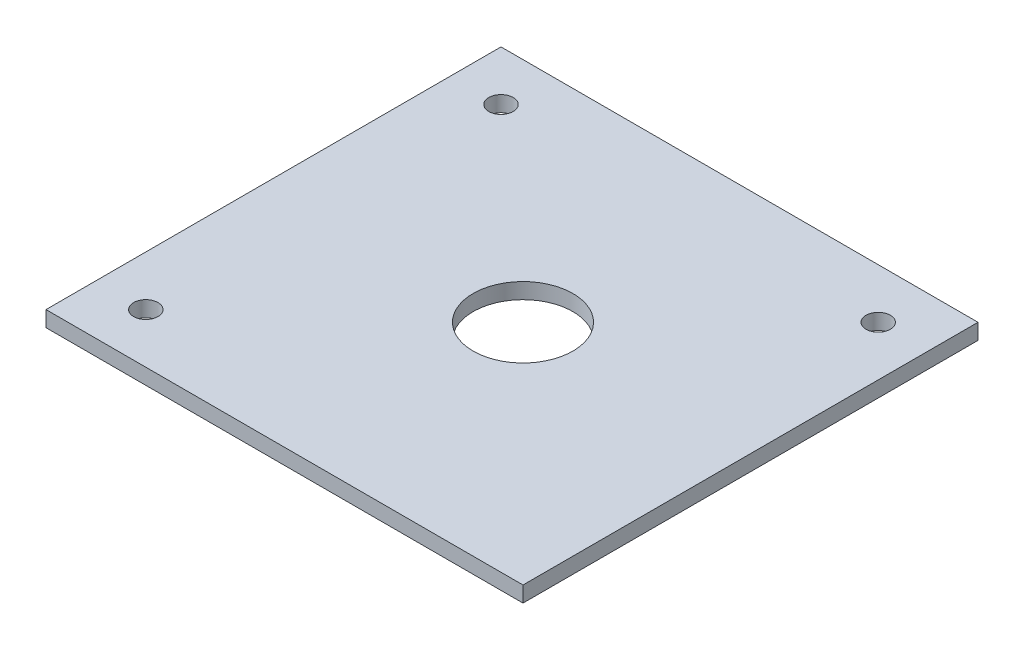
ISO-10303-21;
HEADER;
FILE_DESCRIPTION(('STEP AP214'),'2;1');
FILE_NAME('part.step','',(''),(''),'','','');
FILE_SCHEMA(('AUTOMOTIVE_DESIGN { 1 0 10303 214 1 1 1 1 }'));
ENDSEC;
DATA;
#1=APPLICATION_CONTEXT('core data for automotive mechanical design processes');
#2=APPLICATION_PROTOCOL_DEFINITION('international standard','automotive_design',2000,#1);
#3=PRODUCT_CONTEXT('',#1,'mechanical');
#4=PRODUCT('Part','Part','',(#3));
#5=PRODUCT_RELATED_PRODUCT_CATEGORY('part','',(#4));
#6=PRODUCT_DEFINITION_FORMATION('','',#4);
#7=PRODUCT_DEFINITION_CONTEXT('part definition',#1,'design');
#8=PRODUCT_DEFINITION('design','',#6,#7);
#9=PRODUCT_DEFINITION_SHAPE('','',#8);
#10=(LENGTH_UNIT() NAMED_UNIT(*) SI_UNIT(.MILLI.,.METRE.));
#11=(NAMED_UNIT(*) PLANE_ANGLE_UNIT() SI_UNIT($,.RADIAN.));
#12=(NAMED_UNIT(*) SI_UNIT($,.STERADIAN.) SOLID_ANGLE_UNIT());
#13=UNCERTAINTY_MEASURE_WITH_UNIT(LENGTH_MEASURE(1.E-05),#10,'distance_accuracy_value','');
#14=(GEOMETRIC_REPRESENTATION_CONTEXT(3) GLOBAL_UNCERTAINTY_ASSIGNED_CONTEXT((#13)) GLOBAL_UNIT_ASSIGNED_CONTEXT((#10,
#11,#12)) REPRESENTATION_CONTEXT('',''));
#15=CARTESIAN_POINT('',(0.,0.,0.));
#16=DIRECTION('',(0.,0.,1.));
#17=DIRECTION('',(1.,0.,0.));
#18=AXIS2_PLACEMENT_3D('',#15,#16,#17);
#19=CARTESIAN_POINT('',(0.,4.,0.));
#20=DIRECTION('',(0.,1.,0.));
#21=DIRECTION('',(0.,0.,1.));
#22=AXIS2_PLACEMENT_3D('',#19,#20,#21);
#23=PLANE('',#22);
#24=CARTESIAN_POINT('',(109.417527054984,4.,12.7));
#25=DIRECTION('',(0.,1.,0.));
#26=DIRECTION('',(0.,0.,1.));
#27=AXIS2_PLACEMENT_3D('',#24,#25,#26);
#28=CIRCLE('',#27,3.1);
#29=CARTESIAN_POINT('',(109.417527054984,4.,15.8));
#30=VERTEX_POINT('',#29);
#31=EDGE_CURVE('E131',#30,#30,#28,.T.);
#32=ORIENTED_EDGE('',*,*,#31,.F.);
#33=EDGE_LOOP('',(#32));
#34=FACE_BOUND('',#33,.T.);
#35=CARTESIAN_POINT('',(64.2175270549846,4.,57.9));
#36=DIRECTION('',(0.,1.,0.));
#37=DIRECTION('',(0.,0.,1.));
#38=AXIS2_PLACEMENT_3D('',#35,#36,#37);
#39=CIRCLE('',#38,12.7);
#40=CARTESIAN_POINT('',(64.2175270549846,4.,70.6));
#41=VERTEX_POINT('',#40);
#42=EDGE_CURVE('E110',#41,#41,#39,.T.);
#43=ORIENTED_EDGE('',*,*,#42,.F.);
#44=EDGE_LOOP('',(#43));
#45=FACE_BOUND('',#44,.T.);
#46=DIRECTION('',(0.,0.,-1.));
#47=VECTOR('',#46,1.);
#48=CARTESIAN_POINT('',(122.117527054984,4.,0.));
#49=LINE('',#48,#47);
#50=CARTESIAN_POINT('',(122.117527054984,4.,115.8));
#51=VERTEX_POINT('',#50);
#52=CARTESIAN_POINT('',(122.117527054984,4.,0.));
#53=VERTEX_POINT('',#52);
#54=EDGE_CURVE('E95',#51,#53,#49,.T.);
#55=ORIENTED_EDGE('',*,*,#54,.T.);
#56=DIRECTION('',(-1.,0.,0.));
#57=VECTOR('',#56,1.);
#58=CARTESIAN_POINT('',(0.717527054983736,4.,0.));
#59=LINE('',#58,#57);
#60=CARTESIAN_POINT('',(0.717527054983736,4.,0.));
#61=VERTEX_POINT('',#60);
#62=EDGE_CURVE('E90',#53,#61,#59,.T.);
#63=ORIENTED_EDGE('',*,*,#62,.T.);
#64=DIRECTION('',(0.,0.,1.));
#65=VECTOR('',#64,1.);
#66=CARTESIAN_POINT('',(0.717527054983736,4.,0.));
#67=LINE('',#66,#65);
#68=CARTESIAN_POINT('',(0.717527054983764,4.,115.8));
#69=VERTEX_POINT('',#68);
#70=EDGE_CURVE('E93',#61,#69,#67,.T.);
#71=ORIENTED_EDGE('',*,*,#70,.T.);
#72=DIRECTION('',(1.,0.,0.));
#73=VECTOR('',#72,1.);
#74=CARTESIAN_POINT('',(0.717527054983764,4.,115.8));
#75=LINE('',#74,#73);
#76=EDGE_CURVE('E60',#69,#51,#75,.T.);
#77=ORIENTED_EDGE('',*,*,#76,.T.);
#78=EDGE_LOOP('',(#55,#63,#71,#77));
#79=FACE_BOUND('',#78,.T.);
#80=CARTESIAN_POINT('',(13.4175270549837,4.,12.7));
#81=DIRECTION('',(0.,1.,0.));
#82=DIRECTION('',(0.,0.,1.));
#83=AXIS2_PLACEMENT_3D('',#80,#81,#82);
#84=CIRCLE('',#83,3.1);
#85=CARTESIAN_POINT('',(13.4175270549837,4.,15.8));
#86=VERTEX_POINT('',#85);
#87=EDGE_CURVE('E125',#86,#86,#84,.T.);
#88=ORIENTED_EDGE('',*,*,#87,.F.);
#89=EDGE_LOOP('',(#88));
#90=FACE_BOUND('',#89,.T.);
#91=CARTESIAN_POINT('',(13.4175270549838,4.,103.1));
#92=DIRECTION('',(0.,1.,0.));
#93=DIRECTION('',(0.,0.,1.));
#94=AXIS2_PLACEMENT_3D('',#91,#92,#93);
#95=CIRCLE('',#94,3.10000000000001);
#96=CARTESIAN_POINT('',(13.4175270549838,4.,106.2));
#97=VERTEX_POINT('',#96);
#98=EDGE_CURVE('E137',#97,#97,#95,.T.);
#99=ORIENTED_EDGE('',*,*,#98,.F.);
#100=EDGE_LOOP('',(#99));
#101=FACE_BOUND('',#100,.T.);
#102=ADVANCED_FACE('F43',(#34,#45,#79,#90,#101),#23,.T.);
#103=CARTESIAN_POINT('',(0.,0.,0.));
#104=DIRECTION('',(0.,1.,0.));
#105=DIRECTION('',(0.,0.,1.));
#106=AXIS2_PLACEMENT_3D('',#103,#104,#105);
#107=PLANE('',#106);
#108=DIRECTION('',(0.,0.,-1.));
#109=VECTOR('',#108,1.);
#110=CARTESIAN_POINT('',(122.117527054984,0.,0.));
#111=LINE('',#110,#109);
#112=CARTESIAN_POINT('',(122.117527054984,0.,115.8));
#113=VERTEX_POINT('',#112);
#114=CARTESIAN_POINT('',(122.117527054984,0.,0.));
#115=VERTEX_POINT('',#114);
#116=EDGE_CURVE('E107',#113,#115,#111,.T.);
#117=ORIENTED_EDGE('',*,*,#116,.F.);
#118=DIRECTION('',(1.,0.,0.));
#119=VECTOR('',#118,1.);
#120=CARTESIAN_POINT('',(0.717527054983764,0.,115.8));
#121=LINE('',#120,#119);
#122=CARTESIAN_POINT('',(0.717527054983764,0.,115.8));
#123=VERTEX_POINT('',#122);
#124=EDGE_CURVE('E83',#123,#113,#121,.T.);
#125=ORIENTED_EDGE('',*,*,#124,.F.);
#126=DIRECTION('',(0.,0.,1.));
#127=VECTOR('',#126,1.);
#128=CARTESIAN_POINT('',(0.717527054983736,0.,0.));
#129=LINE('',#128,#127);
#130=CARTESIAN_POINT('',(0.717527054983736,0.,0.));
#131=VERTEX_POINT('',#130);
#132=EDGE_CURVE('E77',#131,#123,#129,.T.);
#133=ORIENTED_EDGE('',*,*,#132,.F.);
#134=DIRECTION('',(-1.,0.,0.));
#135=VECTOR('',#134,1.);
#136=CARTESIAN_POINT('',(0.717527054983736,0.,0.));
#137=LINE('',#136,#135);
#138=EDGE_CURVE('E99',#115,#131,#137,.T.);
#139=ORIENTED_EDGE('',*,*,#138,.F.);
#140=EDGE_LOOP('',(#117,#125,#133,#139));
#141=FACE_BOUND('',#140,.T.);
#142=CARTESIAN_POINT('',(64.2175270549846,0.,57.9));
#143=DIRECTION('',(0.,1.,0.));
#144=DIRECTION('',(0.,0.,1.));
#145=AXIS2_PLACEMENT_3D('',#142,#143,#144);
#146=CIRCLE('',#145,12.7);
#147=CARTESIAN_POINT('',(64.2175270549846,0.,70.6));
#148=VERTEX_POINT('',#147);
#149=EDGE_CURVE('E122',#148,#148,#146,.T.);
#150=ORIENTED_EDGE('',*,*,#149,.T.);
#151=EDGE_LOOP('',(#150));
#152=FACE_BOUND('',#151,.T.);
#153=CARTESIAN_POINT('',(13.4175270549837,0.,12.7));
#154=DIRECTION('',(0.,1.,0.));
#155=DIRECTION('',(0.,0.,1.));
#156=AXIS2_PLACEMENT_3D('',#153,#154,#155);
#157=CIRCLE('',#156,3.1);
#158=CARTESIAN_POINT('',(13.4175270549837,0.,15.8));
#159=VERTEX_POINT('',#158);
#160=EDGE_CURVE('E128',#159,#159,#157,.T.);
#161=ORIENTED_EDGE('',*,*,#160,.T.);
#162=EDGE_LOOP('',(#161));
#163=FACE_BOUND('',#162,.T.);
#164=CARTESIAN_POINT('',(109.417527054984,0.,12.7));
#165=DIRECTION('',(0.,1.,0.));
#166=DIRECTION('',(0.,0.,1.));
#167=AXIS2_PLACEMENT_3D('',#164,#165,#166);
#168=CIRCLE('',#167,3.1);
#169=CARTESIAN_POINT('',(109.417527054984,0.,15.8));
#170=VERTEX_POINT('',#169);
#171=EDGE_CURVE('E134',#170,#170,#168,.T.);
#172=ORIENTED_EDGE('',*,*,#171,.T.);
#173=EDGE_LOOP('',(#172));
#174=FACE_BOUND('',#173,.T.);
#175=CARTESIAN_POINT('',(13.4175270549838,0.,103.1));
#176=DIRECTION('',(0.,1.,0.));
#177=DIRECTION('',(0.,0.,1.));
#178=AXIS2_PLACEMENT_3D('',#175,#176,#177);
#179=CIRCLE('',#178,3.10000000000001);
#180=CARTESIAN_POINT('',(13.4175270549838,0.,106.2));
#181=VERTEX_POINT('',#180);
#182=EDGE_CURVE('E140',#181,#181,#179,.T.);
#183=ORIENTED_EDGE('',*,*,#182,.T.);
#184=EDGE_LOOP('',(#183));
#185=FACE_BOUND('',#184,.T.);
#186=ADVANCED_FACE('F118',(#141,#152,#163,#174,#185),#107,.F.);
#187=CARTESIAN_POINT('',(122.117527054984,4.,0.));
#188=DIRECTION('',(-1.,0.,0.));
#189=DIRECTION('',(0.,0.,1.));
#190=AXIS2_PLACEMENT_3D('',#187,#188,#189);
#191=PLANE('',#190);
#192=ORIENTED_EDGE('',*,*,#116,.T.);
#193=DIRECTION('',(0.,-1.,0.));
#194=VECTOR('',#193,1.);
#195=CARTESIAN_POINT('',(122.117527054984,4.,0.));
#196=LINE('',#195,#194);
#197=EDGE_CURVE('E11',#53,#115,#196,.T.);
#198=ORIENTED_EDGE('',*,*,#197,.F.);
#199=ORIENTED_EDGE('',*,*,#54,.F.);
#200=DIRECTION('',(0.,-1.,0.));
#201=VECTOR('',#200,1.);
#202=CARTESIAN_POINT('',(122.117527054984,4.,115.8));
#203=LINE('',#202,#201);
#204=EDGE_CURVE('E103',#51,#113,#203,.T.);
#205=ORIENTED_EDGE('',*,*,#204,.T.);
#206=EDGE_LOOP('',(#192,#198,#199,#205));
#207=FACE_BOUND('',#206,.T.);
#208=ADVANCED_FACE('F45',(#207),#191,.F.);
#209=CARTESIAN_POINT('',(0.717527054983736,4.,0.));
#210=DIRECTION('',(0.,0.,1.));
#211=DIRECTION('',(1.,0.,0.));
#212=AXIS2_PLACEMENT_3D('',#209,#210,#211);
#213=PLANE('',#212);
#214=ORIENTED_EDGE('',*,*,#138,.T.);
#215=DIRECTION('',(0.,-1.,0.));
#216=VECTOR('',#215,1.);
#217=CARTESIAN_POINT('',(0.717527054983736,4.,0.));
#218=LINE('',#217,#216);
#219=EDGE_CURVE('E52',#61,#131,#218,.T.);
#220=ORIENTED_EDGE('',*,*,#219,.F.);
#221=ORIENTED_EDGE('',*,*,#62,.F.);
#222=ORIENTED_EDGE('',*,*,#197,.T.);
#223=EDGE_LOOP('',(#214,#220,#221,#222));
#224=FACE_BOUND('',#223,.T.);
#225=ADVANCED_FACE('F98',(#224),#213,.F.);
#226=CARTESIAN_POINT('',(0.717527054983736,4.,0.));
#227=DIRECTION('',(1.,0.,0.));
#228=DIRECTION('',(0.,0.,-1.));
#229=AXIS2_PLACEMENT_3D('',#226,#227,#228);
#230=PLANE('',#229);
#231=ORIENTED_EDGE('',*,*,#132,.T.);
#232=DIRECTION('',(0.,-1.,0.));
#233=VECTOR('',#232,1.);
#234=CARTESIAN_POINT('',(0.717527054983764,4.,115.8));
#235=LINE('',#234,#233);
#236=EDGE_CURVE('E100',#69,#123,#235,.T.);
#237=ORIENTED_EDGE('',*,*,#236,.F.);
#238=ORIENTED_EDGE('',*,*,#70,.F.);
#239=ORIENTED_EDGE('',*,*,#219,.T.);
#240=EDGE_LOOP('',(#231,#237,#238,#239));
#241=FACE_BOUND('',#240,.T.);
#242=ADVANCED_FACE('F101',(#241),#230,.F.);
#243=CARTESIAN_POINT('',(0.717527054983764,4.,115.8));
#244=DIRECTION('',(0.,0.,-1.));
#245=DIRECTION('',(-1.,0.,0.));
#246=AXIS2_PLACEMENT_3D('',#243,#244,#245);
#247=PLANE('',#246);
#248=ORIENTED_EDGE('',*,*,#124,.T.);
#249=ORIENTED_EDGE('',*,*,#204,.F.);
#250=ORIENTED_EDGE('',*,*,#76,.F.);
#251=ORIENTED_EDGE('',*,*,#236,.T.);
#252=EDGE_LOOP('',(#248,#249,#250,#251));
#253=FACE_BOUND('',#252,.T.);
#254=ADVANCED_FACE('F115',(#253),#247,.F.);
#255=CARTESIAN_POINT('',(64.2175270549846,4.,57.9));
#256=DIRECTION('',(0.,-1.,0.));
#257=DIRECTION('',(0.,0.,-1.));
#258=AXIS2_PLACEMENT_3D('',#255,#256,#257);
#259=CYLINDRICAL_SURFACE('',#258,12.7);
#260=ORIENTED_EDGE('',*,*,#42,.T.);
#261=EDGE_LOOP('',(#260));
#262=FACE_BOUND('',#261,.T.);
#263=ORIENTED_EDGE('',*,*,#149,.F.);
#264=EDGE_LOOP('',(#263));
#265=FACE_BOUND('',#264,.T.);
#266=ADVANCED_FACE('F159',(#262,#265),#259,.F.);
#267=CARTESIAN_POINT('',(13.4175270549837,4.,12.7));
#268=DIRECTION('',(0.,-1.,0.));
#269=DIRECTION('',(0.,0.,-1.));
#270=AXIS2_PLACEMENT_3D('',#267,#268,#269);
#271=CYLINDRICAL_SURFACE('',#270,3.1);
#272=ORIENTED_EDGE('',*,*,#87,.T.);
#273=EDGE_LOOP('',(#272));
#274=FACE_BOUND('',#273,.T.);
#275=ORIENTED_EDGE('',*,*,#160,.F.);
#276=EDGE_LOOP('',(#275));
#277=FACE_BOUND('',#276,.T.);
#278=ADVANCED_FACE('F204',(#274,#277),#271,.F.);
#279=CARTESIAN_POINT('',(109.417527054984,4.,12.7));
#280=DIRECTION('',(0.,-1.,0.));
#281=DIRECTION('',(0.,0.,-1.));
#282=AXIS2_PLACEMENT_3D('',#279,#280,#281);
#283=CYLINDRICAL_SURFACE('',#282,3.1);
#284=ORIENTED_EDGE('',*,*,#31,.T.);
#285=EDGE_LOOP('',(#284));
#286=FACE_BOUND('',#285,.T.);
#287=ORIENTED_EDGE('',*,*,#171,.F.);
#288=EDGE_LOOP('',(#287));
#289=FACE_BOUND('',#288,.T.);
#290=ADVANCED_FACE('F212',(#286,#289),#283,.F.);
#291=CARTESIAN_POINT('',(13.4175270549838,4.,103.1));
#292=DIRECTION('',(0.,-1.,0.));
#293=DIRECTION('',(0.,0.,-1.));
#294=AXIS2_PLACEMENT_3D('',#291,#292,#293);
#295=CYLINDRICAL_SURFACE('',#294,3.10000000000001);
#296=ORIENTED_EDGE('',*,*,#98,.T.);
#297=EDGE_LOOP('',(#296));
#298=FACE_BOUND('',#297,.T.);
#299=ORIENTED_EDGE('',*,*,#182,.F.);
#300=EDGE_LOOP('',(#299));
#301=FACE_BOUND('',#300,.T.);
#302=ADVANCED_FACE('F146',(#298,#301),#295,.F.);
#303=CLOSED_SHELL('',(#102,#186,#208,#225,#242,#254,#266,#278,#290,#302));
#304=MANIFOLD_SOLID_BREP('B2',#303);
#305=ADVANCED_BREP_SHAPE_REPRESENTATION('',(#18,#304),#14);
#306=SHAPE_DEFINITION_REPRESENTATION(#9,#305);
ENDSEC;
END-ISO-10303-21;
